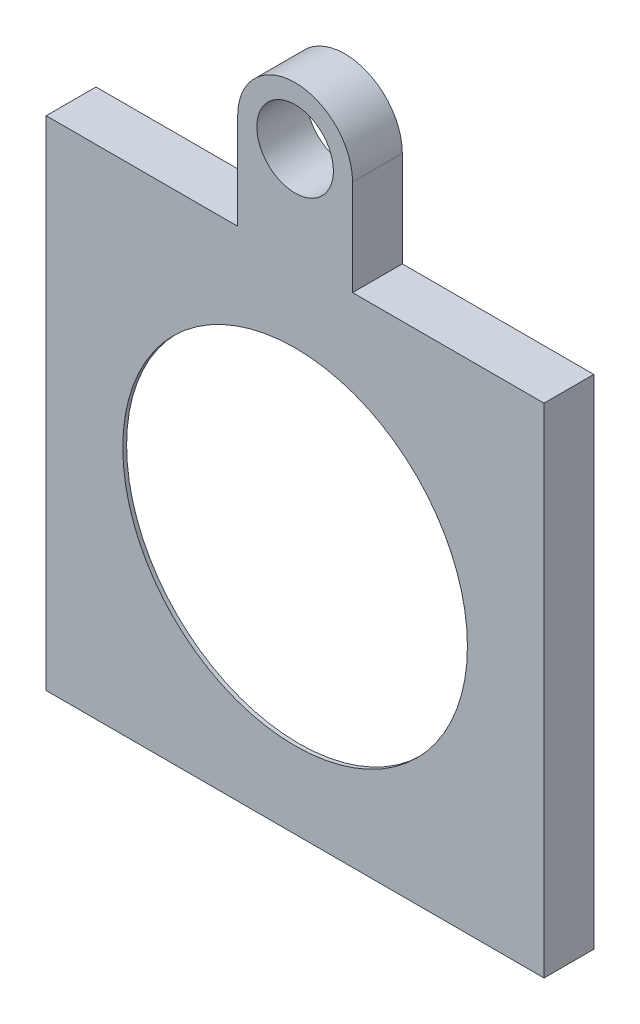
ISO-10303-21;
HEADER;
FILE_DESCRIPTION(('STEP AP214'),'2;1');
FILE_NAME('part.step','',(''),(''),'','','');
FILE_SCHEMA(('AUTOMOTIVE_DESIGN { 1 0 10303 214 1 1 1 1 }'));
ENDSEC;
DATA;
#1=APPLICATION_CONTEXT('core data for automotive mechanical design processes');
#2=APPLICATION_PROTOCOL_DEFINITION('international standard','automotive_design',2000,#1);
#3=PRODUCT_CONTEXT('',#1,'mechanical');
#4=PRODUCT('Part','Part','',(#3));
#5=PRODUCT_RELATED_PRODUCT_CATEGORY('part','',(#4));
#6=PRODUCT_DEFINITION_FORMATION('','',#4);
#7=PRODUCT_DEFINITION_CONTEXT('part definition',#1,'design');
#8=PRODUCT_DEFINITION('design','',#6,#7);
#9=PRODUCT_DEFINITION_SHAPE('','',#8);
#10=(LENGTH_UNIT() NAMED_UNIT(*) SI_UNIT(.MILLI.,.METRE.));
#11=(NAMED_UNIT(*) PLANE_ANGLE_UNIT() SI_UNIT($,.RADIAN.));
#12=(NAMED_UNIT(*) SI_UNIT($,.STERADIAN.) SOLID_ANGLE_UNIT());
#13=UNCERTAINTY_MEASURE_WITH_UNIT(LENGTH_MEASURE(1.E-05),#10,'distance_accuracy_value','');
#14=(GEOMETRIC_REPRESENTATION_CONTEXT(3) GLOBAL_UNCERTAINTY_ASSIGNED_CONTEXT((#13)) GLOBAL_UNIT_ASSIGNED_CONTEXT((#10,
#11,#12)) REPRESENTATION_CONTEXT('',''));
#15=CARTESIAN_POINT('',(0.,0.,0.));
#16=DIRECTION('',(0.,0.,1.));
#17=DIRECTION('',(1.,0.,0.));
#18=AXIS2_PLACEMENT_3D('',#15,#16,#17);
#19=CARTESIAN_POINT('',(0.,0.,0.));
#20=DIRECTION('',(0.,0.,1.));
#21=DIRECTION('',(1.,0.,0.));
#22=AXIS2_PLACEMENT_3D('',#19,#20,#21);
#23=PLANE('',#22);
#24=CARTESIAN_POINT('',(0.,9.,0.));
#25=DIRECTION('',(0.,0.,1.));
#26=DIRECTION('',(1.,0.,0.));
#27=AXIS2_PLACEMENT_3D('',#24,#25,#26);
#28=CIRCLE('',#27,1.);
#29=CARTESIAN_POINT('',(1.,9.,0.));
#30=VERTEX_POINT('',#29);
#31=EDGE_CURVE('E159',#30,#30,#28,.T.);
#32=ORIENTED_EDGE('',*,*,#31,.T.);
#33=EDGE_LOOP('',(#32));
#34=FACE_BOUND('',#33,.T.);
#35=DIRECTION('',(0.,-1.,0.));
#36=VECTOR('',#35,1.);
#37=CARTESIAN_POINT('',(-6.,6.,0.));
#38=LINE('',#37,#36);
#39=CARTESIAN_POINT('',(-6.,6.,0.));
#40=VERTEX_POINT('',#39);
#41=CARTESIAN_POINT('',(-6.,-6.,0.));
#42=VERTEX_POINT('',#41);
#43=EDGE_CURVE('E249',#40,#42,#38,.T.);
#44=ORIENTED_EDGE('',*,*,#43,.T.);
#45=DIRECTION('',(1.,0.,0.));
#46=VECTOR('',#45,1.);
#47=CARTESIAN_POINT('',(6.,-6.,0.));
#48=LINE('',#47,#46);
#49=CARTESIAN_POINT('',(6.,-6.,0.));
#50=VERTEX_POINT('',#49);
#51=EDGE_CURVE('E251',#42,#50,#48,.T.);
#52=ORIENTED_EDGE('',*,*,#51,.T.);
#53=DIRECTION('',(0.,1.,0.));
#54=VECTOR('',#53,1.);
#55=CARTESIAN_POINT('',(6.,6.,0.));
#56=LINE('',#55,#54);
#57=CARTESIAN_POINT('',(6.,6.,0.));
#58=VERTEX_POINT('',#57);
#59=EDGE_CURVE('E270',#50,#58,#56,.T.);
#60=ORIENTED_EDGE('',*,*,#59,.T.);
#61=DIRECTION('',(-1.,0.,0.));
#62=VECTOR('',#61,1.);
#63=CARTESIAN_POINT('',(6.,6.,0.));
#64=LINE('',#63,#62);
#65=EDGE_CURVE('E258',#58,#40,#64,.T.);
#66=ORIENTED_EDGE('',*,*,#65,.T.);
#67=EDGE_LOOP('',(#44,#52,#60,#66));
#68=FACE_BOUND('',#67,.T.);
#69=CARTESIAN_POINT('',(0.,9.,0.));
#70=DIRECTION('',(0.,0.,1.));
#71=DIRECTION('',(1.,0.,0.));
#72=AXIS2_PLACEMENT_3D('',#69,#70,#71);
#73=CIRCLE('',#72,1.5);
#74=CARTESIAN_POINT('',(1.5,9.,0.));
#75=VERTEX_POINT('',#74);
#76=CARTESIAN_POINT('',(-1.5,9.,0.));
#77=VERTEX_POINT('',#76);
#78=EDGE_CURVE('E188',#75,#77,#73,.T.);
#79=ORIENTED_EDGE('',*,*,#78,.F.);
#80=DIRECTION('',(0.,-1.,0.));
#81=VECTOR('',#80,1.);
#82=CARTESIAN_POINT('',(1.5,10.5,0.));
#83=LINE('',#82,#81);
#84=CARTESIAN_POINT('',(1.5,6.5,0.));
#85=VERTEX_POINT('',#84);
#86=EDGE_CURVE('E158',#75,#85,#83,.T.);
#87=ORIENTED_EDGE('',*,*,#86,.T.);
#88=DIRECTION('',(-1.,0.,0.));
#89=VECTOR('',#88,1.);
#90=CARTESIAN_POINT('',(6.5,6.5,0.));
#91=LINE('',#90,#89);
#92=CARTESIAN_POINT('',(6.5,6.5,0.));
#93=VERTEX_POINT('',#92);
#94=EDGE_CURVE('E212',#93,#85,#91,.T.);
#95=ORIENTED_EDGE('',*,*,#94,.F.);
#96=DIRECTION('',(0.,1.,0.));
#97=VECTOR('',#96,1.);
#98=CARTESIAN_POINT('',(6.5,6.5,0.));
#99=LINE('',#98,#97);
#100=CARTESIAN_POINT('',(6.5,-6.5,0.));
#101=VERTEX_POINT('',#100);
#102=EDGE_CURVE('E223',#101,#93,#99,.T.);
#103=ORIENTED_EDGE('',*,*,#102,.F.);
#104=DIRECTION('',(1.,0.,0.));
#105=VECTOR('',#104,1.);
#106=CARTESIAN_POINT('',(6.5,-6.5,0.));
#107=LINE('',#106,#105);
#108=CARTESIAN_POINT('',(-6.5,-6.5,0.));
#109=VERTEX_POINT('',#108);
#110=EDGE_CURVE('E221',#109,#101,#107,.T.);
#111=ORIENTED_EDGE('',*,*,#110,.F.);
#112=DIRECTION('',(0.,-1.,0.));
#113=VECTOR('',#112,1.);
#114=CARTESIAN_POINT('',(-6.5,6.5,0.));
#115=LINE('',#114,#113);
#116=CARTESIAN_POINT('',(-6.5,6.5,0.));
#117=VERTEX_POINT('',#116);
#118=EDGE_CURVE('E218',#117,#109,#115,.T.);
#119=ORIENTED_EDGE('',*,*,#118,.F.);
#120=CARTESIAN_POINT('',(-1.5,6.5,0.));
#121=VERTEX_POINT('',#120);
#122=EDGE_CURVE('E209',#121,#117,#91,.T.);
#123=ORIENTED_EDGE('',*,*,#122,.F.);
#124=DIRECTION('',(0.,-1.,0.));
#125=VECTOR('',#124,1.);
#126=CARTESIAN_POINT('',(-1.5,10.5,0.));
#127=LINE('',#126,#125);
#128=EDGE_CURVE('E168',#77,#121,#127,.T.);
#129=ORIENTED_EDGE('',*,*,#128,.F.);
#130=EDGE_LOOP('',(#79,#87,#95,#103,#111,#119,#123,#129));
#131=FACE_BOUND('',#130,.T.);
#132=ADVANCED_FACE('F57',(#34,#68,#131),#23,.F.);
#133=CARTESIAN_POINT('',(0.,0.,1.3));
#134=DIRECTION('',(0.,0.,-1.));
#135=DIRECTION('',(-1.,0.,0.));
#136=AXIS2_PLACEMENT_3D('',#133,#134,#135);
#137=PLANE('',#136);
#138=CARTESIAN_POINT('',(0.,9.,1.3));
#139=DIRECTION('',(0.,0.,1.));
#140=DIRECTION('',(1.,0.,0.));
#141=AXIS2_PLACEMENT_3D('',#138,#139,#140);
#142=CIRCLE('',#141,1.);
#143=CARTESIAN_POINT('',(1.,9.,1.3));
#144=VERTEX_POINT('',#143);
#145=EDGE_CURVE('E333',#144,#144,#142,.T.);
#146=ORIENTED_EDGE('',*,*,#145,.F.);
#147=EDGE_LOOP('',(#146));
#148=FACE_BOUND('',#147,.T.);
#149=CARTESIAN_POINT('',(0.,0.,1.3));
#150=DIRECTION('',(0.,0.,1.));
#151=DIRECTION('',(1.,0.,0.));
#152=AXIS2_PLACEMENT_3D('',#149,#150,#151);
#153=CIRCLE('',#152,4.5);
#154=CARTESIAN_POINT('',(4.5,0.,1.3));
#155=VERTEX_POINT('',#154);
#156=EDGE_CURVE('E194',#155,#155,#153,.T.);
#157=ORIENTED_EDGE('',*,*,#156,.F.);
#158=EDGE_LOOP('',(#157));
#159=FACE_BOUND('',#158,.T.);
#160=DIRECTION('',(0.,-1.,0.));
#161=VECTOR('',#160,1.);
#162=CARTESIAN_POINT('',(1.5,10.5,1.3));
#163=LINE('',#162,#161);
#164=CARTESIAN_POINT('',(1.5,9.,1.3));
#165=VERTEX_POINT('',#164);
#166=CARTESIAN_POINT('',(1.49999999999999,6.5,1.3));
#167=VERTEX_POINT('',#166);
#168=EDGE_CURVE('E61',#165,#167,#163,.T.);
#169=ORIENTED_EDGE('',*,*,#168,.F.);
#170=CARTESIAN_POINT('',(0.,9.,1.3));
#171=DIRECTION('',(0.,0.,1.));
#172=DIRECTION('',(1.,0.,0.));
#173=AXIS2_PLACEMENT_3D('',#170,#171,#172);
#174=CIRCLE('',#173,1.5);
#175=CARTESIAN_POINT('',(-1.5,9.,1.3));
#176=VERTEX_POINT('',#175);
#177=EDGE_CURVE('E150',#165,#176,#174,.T.);
#178=ORIENTED_EDGE('',*,*,#177,.T.);
#179=DIRECTION('',(0.,-1.,0.));
#180=VECTOR('',#179,1.);
#181=CARTESIAN_POINT('',(-1.5,10.5,1.3));
#182=LINE('',#181,#180);
#183=CARTESIAN_POINT('',(-1.50000000000001,6.5,1.3));
#184=VERTEX_POINT('',#183);
#185=EDGE_CURVE('E75',#176,#184,#182,.T.);
#186=ORIENTED_EDGE('',*,*,#185,.T.);
#187=DIRECTION('',(-1.,0.,0.));
#188=VECTOR('',#187,1.);
#189=CARTESIAN_POINT('',(-6.5,6.5,1.3));
#190=LINE('',#189,#188);
#191=CARTESIAN_POINT('',(-6.5,6.5,1.3));
#192=VERTEX_POINT('',#191);
#193=EDGE_CURVE('E201',#184,#192,#190,.T.);
#194=ORIENTED_EDGE('',*,*,#193,.T.);
#195=DIRECTION('',(0.,-1.,0.));
#196=VECTOR('',#195,1.);
#197=CARTESIAN_POINT('',(-6.5,-6.5,1.3));
#198=LINE('',#197,#196);
#199=CARTESIAN_POINT('',(-6.5,-6.5,1.3));
#200=VERTEX_POINT('',#199);
#201=EDGE_CURVE('E204',#192,#200,#198,.T.);
#202=ORIENTED_EDGE('',*,*,#201,.T.);
#203=DIRECTION('',(1.,0.,0.));
#204=VECTOR('',#203,1.);
#205=CARTESIAN_POINT('',(-6.5,-6.5,1.3));
#206=LINE('',#205,#204);
#207=CARTESIAN_POINT('',(6.5,-6.5,1.3));
#208=VERTEX_POINT('',#207);
#209=EDGE_CURVE('E237',#200,#208,#206,.T.);
#210=ORIENTED_EDGE('',*,*,#209,.T.);
#211=DIRECTION('',(0.,1.,0.));
#212=VECTOR('',#211,1.);
#213=CARTESIAN_POINT('',(6.5,-6.5,1.3));
#214=LINE('',#213,#212);
#215=CARTESIAN_POINT('',(6.5,6.5,1.3));
#216=VERTEX_POINT('',#215);
#217=EDGE_CURVE('E197',#208,#216,#214,.T.);
#218=ORIENTED_EDGE('',*,*,#217,.T.);
#219=EDGE_CURVE('E165',#216,#167,#190,.T.);
#220=ORIENTED_EDGE('',*,*,#219,.T.);
#221=EDGE_LOOP('',(#169,#178,#186,#194,#202,#210,#218,#220));
#222=FACE_BOUND('',#221,.T.);
#223=ADVANCED_FACE('F162',(#148,#159,#222),#137,.F.);
#224=CARTESIAN_POINT('',(-1.5,10.5,0.));
#225=DIRECTION('',(1.,0.,0.));
#226=DIRECTION('',(0.,0.,-1.));
#227=AXIS2_PLACEMENT_3D('',#224,#225,#226);
#228=PLANE('',#227);
#229=DIRECTION('',(0.,0.,1.));
#230=VECTOR('',#229,1.);
#231=CARTESIAN_POINT('',(-1.5,9.,-2.7));
#232=LINE('',#231,#230);
#233=EDGE_CURVE('E155',#77,#176,#232,.T.);
#234=ORIENTED_EDGE('',*,*,#233,.F.);
#235=ORIENTED_EDGE('',*,*,#128,.T.);
#236=DIRECTION('',(0.,0.,1.));
#237=VECTOR('',#236,1.);
#238=CARTESIAN_POINT('',(-1.5,6.5,0.));
#239=LINE('',#238,#237);
#240=EDGE_CURVE('E184',#121,#184,#239,.T.);
#241=ORIENTED_EDGE('',*,*,#240,.T.);
#242=ORIENTED_EDGE('',*,*,#185,.F.);
#243=EDGE_LOOP('',(#234,#235,#241,#242));
#244=FACE_BOUND('',#243,.T.);
#245=ADVANCED_FACE('F312',(#244),#228,.F.);
#246=CARTESIAN_POINT('',(6.5,6.5,1.2));
#247=DIRECTION('',(0.,-1.,0.));
#248=DIRECTION('',(1.,0.,0.));
#249=AXIS2_PLACEMENT_3D('',#246,#247,#248);
#250=PLANE('',#249);
#251=ORIENTED_EDGE('',*,*,#240,.F.);
#252=ORIENTED_EDGE('',*,*,#122,.T.);
#253=DIRECTION('',(0.,0.,-1.));
#254=VECTOR('',#253,1.);
#255=CARTESIAN_POINT('',(-6.5,6.5,1.2));
#256=LINE('',#255,#254);
#257=EDGE_CURVE('E12',#192,#117,#256,.T.);
#258=ORIENTED_EDGE('',*,*,#257,.F.);
#259=ORIENTED_EDGE('',*,*,#193,.F.);
#260=EDGE_LOOP('',(#251,#252,#258,#259));
#261=FACE_BOUND('',#260,.T.);
#262=ADVANCED_FACE('F59',(#261),#250,.F.);
#263=DIRECTION('',(0.,0.,-1.));
#264=VECTOR('',#263,1.);
#265=CARTESIAN_POINT('',(1.5,6.5,0.));
#266=LINE('',#265,#264);
#267=EDGE_CURVE('E172',#167,#85,#266,.T.);
#268=ORIENTED_EDGE('',*,*,#267,.F.);
#269=ORIENTED_EDGE('',*,*,#219,.F.);
#270=DIRECTION('',(0.,0.,-1.));
#271=VECTOR('',#270,1.);
#272=CARTESIAN_POINT('',(6.5,6.5,1.2));
#273=LINE('',#272,#271);
#274=EDGE_CURVE('E225',#216,#93,#273,.T.);
#275=ORIENTED_EDGE('',*,*,#274,.T.);
#276=ORIENTED_EDGE('',*,*,#94,.T.);
#277=EDGE_LOOP('',(#268,#269,#275,#276));
#278=FACE_BOUND('',#277,.T.);
#279=ADVANCED_FACE('F248',(#278),#250,.F.);
#280=CARTESIAN_POINT('',(-6.5,6.5,1.2));
#281=DIRECTION('',(1.,0.,0.));
#282=DIRECTION('',(0.,1.,0.));
#283=AXIS2_PLACEMENT_3D('',#280,#281,#282);
#284=PLANE('',#283);
#285=ORIENTED_EDGE('',*,*,#118,.T.);
#286=DIRECTION('',(0.,0.,-1.));
#287=VECTOR('',#286,1.);
#288=CARTESIAN_POINT('',(-6.5,-6.5,1.2));
#289=LINE('',#288,#287);
#290=EDGE_CURVE('E67',#200,#109,#289,.T.);
#291=ORIENTED_EDGE('',*,*,#290,.F.);
#292=ORIENTED_EDGE('',*,*,#201,.F.);
#293=ORIENTED_EDGE('',*,*,#257,.T.);
#294=EDGE_LOOP('',(#285,#291,#292,#293));
#295=FACE_BOUND('',#294,.T.);
#296=ADVANCED_FACE('F321',(#295),#284,.F.);
#297=CARTESIAN_POINT('',(6.5,-6.5,1.2));
#298=DIRECTION('',(0.,1.,0.));
#299=DIRECTION('',(-1.,0.,0.));
#300=AXIS2_PLACEMENT_3D('',#297,#298,#299);
#301=PLANE('',#300);
#302=ORIENTED_EDGE('',*,*,#110,.T.);
#303=DIRECTION('',(0.,0.,-1.));
#304=VECTOR('',#303,1.);
#305=CARTESIAN_POINT('',(6.5,-6.5,1.2));
#306=LINE('',#305,#304);
#307=EDGE_CURVE('E228',#208,#101,#306,.T.);
#308=ORIENTED_EDGE('',*,*,#307,.F.);
#309=ORIENTED_EDGE('',*,*,#209,.F.);
#310=ORIENTED_EDGE('',*,*,#290,.T.);
#311=EDGE_LOOP('',(#302,#308,#309,#310));
#312=FACE_BOUND('',#311,.T.);
#313=ADVANCED_FACE('F235',(#312),#301,.F.);
#314=CARTESIAN_POINT('',(6.5,6.5,1.2));
#315=DIRECTION('',(-1.,0.,0.));
#316=DIRECTION('',(0.,-1.,0.));
#317=AXIS2_PLACEMENT_3D('',#314,#315,#316);
#318=PLANE('',#317);
#319=ORIENTED_EDGE('',*,*,#102,.T.);
#320=ORIENTED_EDGE('',*,*,#274,.F.);
#321=ORIENTED_EDGE('',*,*,#217,.F.);
#322=ORIENTED_EDGE('',*,*,#307,.T.);
#323=EDGE_LOOP('',(#319,#320,#321,#322));
#324=FACE_BOUND('',#323,.T.);
#325=ADVANCED_FACE('F245',(#324),#318,.F.);
#326=CARTESIAN_POINT('',(-6.,6.,1.2));
#327=DIRECTION('',(1.,0.,0.));
#328=DIRECTION('',(0.,1.,0.));
#329=AXIS2_PLACEMENT_3D('',#326,#327,#328);
#330=PLANE('',#329);
#331=ORIENTED_EDGE('',*,*,#43,.F.);
#332=DIRECTION('',(0.,0.,-1.));
#333=VECTOR('',#332,1.);
#334=CARTESIAN_POINT('',(-6.,6.,1.2));
#335=LINE('',#334,#333);
#336=CARTESIAN_POINT('',(-6.,6.,1.2));
#337=VERTEX_POINT('',#336);
#338=EDGE_CURVE('E266',#337,#40,#335,.T.);
#339=ORIENTED_EDGE('',*,*,#338,.F.);
#340=DIRECTION('',(0.,-1.,0.));
#341=VECTOR('',#340,1.);
#342=CARTESIAN_POINT('',(-6.,6.,1.2));
#343=LINE('',#342,#341);
#344=CARTESIAN_POINT('',(-6.,-6.,1.2));
#345=VERTEX_POINT('',#344);
#346=EDGE_CURVE('E254',#337,#345,#343,.T.);
#347=ORIENTED_EDGE('',*,*,#346,.T.);
#348=DIRECTION('',(0.,0.,-1.));
#349=VECTOR('',#348,1.);
#350=CARTESIAN_POINT('',(-6.,-6.,1.2));
#351=LINE('',#350,#349);
#352=EDGE_CURVE('E213',#345,#42,#351,.T.);
#353=ORIENTED_EDGE('',*,*,#352,.T.);
#354=EDGE_LOOP('',(#331,#339,#347,#353));
#355=FACE_BOUND('',#354,.T.);
#356=ADVANCED_FACE('F285',(#355),#330,.T.);
#357=CARTESIAN_POINT('',(6.,-6.,1.2));
#358=DIRECTION('',(0.,1.,0.));
#359=DIRECTION('',(-1.,0.,0.));
#360=AXIS2_PLACEMENT_3D('',#357,#358,#359);
#361=PLANE('',#360);
#362=ORIENTED_EDGE('',*,*,#51,.F.);
#363=ORIENTED_EDGE('',*,*,#352,.F.);
#364=DIRECTION('',(1.,0.,0.));
#365=VECTOR('',#364,1.);
#366=CARTESIAN_POINT('',(6.,-6.,1.2));
#367=LINE('',#366,#365);
#368=CARTESIAN_POINT('',(6.,-6.,1.2));
#369=VERTEX_POINT('',#368);
#370=EDGE_CURVE('E257',#345,#369,#367,.T.);
#371=ORIENTED_EDGE('',*,*,#370,.T.);
#372=DIRECTION('',(0.,0.,-1.));
#373=VECTOR('',#372,1.);
#374=CARTESIAN_POINT('',(6.,-6.,1.2));
#375=LINE('',#374,#373);
#376=EDGE_CURVE('E278',#369,#50,#375,.T.);
#377=ORIENTED_EDGE('',*,*,#376,.T.);
#378=EDGE_LOOP('',(#362,#363,#371,#377));
#379=FACE_BOUND('',#378,.T.);
#380=ADVANCED_FACE('F295',(#379),#361,.T.);
#381=CARTESIAN_POINT('',(6.,6.,1.2));
#382=DIRECTION('',(-1.,0.,0.));
#383=DIRECTION('',(0.,-1.,0.));
#384=AXIS2_PLACEMENT_3D('',#381,#382,#383);
#385=PLANE('',#384);
#386=ORIENTED_EDGE('',*,*,#59,.F.);
#387=ORIENTED_EDGE('',*,*,#376,.F.);
#388=DIRECTION('',(0.,1.,0.));
#389=VECTOR('',#388,1.);
#390=CARTESIAN_POINT('',(6.,6.,1.2));
#391=LINE('',#390,#389);
#392=CARTESIAN_POINT('',(6.,6.,1.2));
#393=VERTEX_POINT('',#392);
#394=EDGE_CURVE('E261',#369,#393,#391,.T.);
#395=ORIENTED_EDGE('',*,*,#394,.T.);
#396=DIRECTION('',(0.,0.,-1.));
#397=VECTOR('',#396,1.);
#398=CARTESIAN_POINT('',(6.,6.,1.2));
#399=LINE('',#398,#397);
#400=EDGE_CURVE('E277',#393,#58,#399,.T.);
#401=ORIENTED_EDGE('',*,*,#400,.T.);
#402=EDGE_LOOP('',(#386,#387,#395,#401));
#403=FACE_BOUND('',#402,.T.);
#404=ADVANCED_FACE('F297',(#403),#385,.T.);
#405=CARTESIAN_POINT('',(6.,6.,1.2));
#406=DIRECTION('',(0.,-1.,0.));
#407=DIRECTION('',(1.,0.,0.));
#408=AXIS2_PLACEMENT_3D('',#405,#406,#407);
#409=PLANE('',#408);
#410=ORIENTED_EDGE('',*,*,#65,.F.);
#411=ORIENTED_EDGE('',*,*,#400,.F.);
#412=DIRECTION('',(-1.,0.,0.));
#413=VECTOR('',#412,1.);
#414=CARTESIAN_POINT('',(6.,6.,1.2));
#415=LINE('',#414,#413);
#416=EDGE_CURVE('E264',#393,#337,#415,.T.);
#417=ORIENTED_EDGE('',*,*,#416,.T.);
#418=ORIENTED_EDGE('',*,*,#338,.T.);
#419=EDGE_LOOP('',(#410,#411,#417,#418));
#420=FACE_BOUND('',#419,.T.);
#421=ADVANCED_FACE('F291',(#420),#409,.T.);
#422=CARTESIAN_POINT('',(0.,0.,1.2));
#423=DIRECTION('',(0.,0.,-1.));
#424=DIRECTION('',(-1.,0.,0.));
#425=AXIS2_PLACEMENT_3D('',#422,#423,#424);
#426=PLANE('',#425);
#427=ORIENTED_EDGE('',*,*,#370,.F.);
#428=ORIENTED_EDGE('',*,*,#346,.F.);
#429=ORIENTED_EDGE('',*,*,#416,.F.);
#430=ORIENTED_EDGE('',*,*,#394,.F.);
#431=EDGE_LOOP('',(#427,#428,#429,#430));
#432=FACE_BOUND('',#431,.T.);
#433=CARTESIAN_POINT('',(0.,0.,1.2));
#434=DIRECTION('',(0.,0.,1.));
#435=DIRECTION('',(1.,0.,0.));
#436=AXIS2_PLACEMENT_3D('',#433,#434,#435);
#437=CIRCLE('',#436,4.5);
#438=CARTESIAN_POINT('',(4.5,0.,1.2));
#439=VERTEX_POINT('',#438);
#440=EDGE_CURVE('E166',#439,#439,#437,.T.);
#441=ORIENTED_EDGE('',*,*,#440,.T.);
#442=EDGE_LOOP('',(#441));
#443=FACE_BOUND('',#442,.T.);
#444=ADVANCED_FACE('F293',(#432,#443),#426,.T.);
#445=CARTESIAN_POINT('',(0.,0.,1.3));
#446=DIRECTION('',(0.,0.,-1.));
#447=DIRECTION('',(-1.,0.,0.));
#448=AXIS2_PLACEMENT_3D('',#445,#446,#447);
#449=CYLINDRICAL_SURFACE('',#448,4.5);
#450=ORIENTED_EDGE('',*,*,#156,.T.);
#451=EDGE_LOOP('',(#450));
#452=FACE_BOUND('',#451,.T.);
#453=ORIENTED_EDGE('',*,*,#440,.F.);
#454=EDGE_LOOP('',(#453));
#455=FACE_BOUND('',#454,.T.);
#456=ADVANCED_FACE('F342',(#452,#455),#449,.F.);
#457=CARTESIAN_POINT('',(1.5,10.5,0.));
#458=DIRECTION('',(-1.,0.,0.));
#459=DIRECTION('',(0.,0.,1.));
#460=AXIS2_PLACEMENT_3D('',#457,#458,#459);
#461=PLANE('',#460);
#462=ORIENTED_EDGE('',*,*,#86,.F.);
#463=DIRECTION('',(0.,0.,1.));
#464=VECTOR('',#463,1.);
#465=CARTESIAN_POINT('',(1.5,9.,-2.7));
#466=LINE('',#465,#464);
#467=EDGE_CURVE('E152',#75,#165,#466,.T.);
#468=ORIENTED_EDGE('',*,*,#467,.T.);
#469=ORIENTED_EDGE('',*,*,#168,.T.);
#470=ORIENTED_EDGE('',*,*,#267,.T.);
#471=EDGE_LOOP('',(#462,#468,#469,#470));
#472=FACE_BOUND('',#471,.T.);
#473=ADVANCED_FACE('F157',(#472),#461,.F.);
#474=CARTESIAN_POINT('',(0.,9.,-2.7));
#475=DIRECTION('',(0.,0.,1.));
#476=DIRECTION('',(1.,0.,0.));
#477=AXIS2_PLACEMENT_3D('',#474,#475,#476);
#478=CYLINDRICAL_SURFACE('',#477,1.5);
#479=ORIENTED_EDGE('',*,*,#78,.T.);
#480=ORIENTED_EDGE('',*,*,#233,.T.);
#481=ORIENTED_EDGE('',*,*,#177,.F.);
#482=ORIENTED_EDGE('',*,*,#467,.F.);
#483=EDGE_LOOP('',(#479,#480,#481,#482));
#484=FACE_BOUND('',#483,.T.);
#485=ADVANCED_FACE('F151',(#484),#478,.T.);
#486=CARTESIAN_POINT('',(0.,9.,-2.7));
#487=DIRECTION('',(0.,0.,1.));
#488=DIRECTION('',(1.,0.,0.));
#489=AXIS2_PLACEMENT_3D('',#486,#487,#488);
#490=CYLINDRICAL_SURFACE('',#489,1.);
#491=ORIENTED_EDGE('',*,*,#145,.T.);
#492=EDGE_LOOP('',(#491));
#493=FACE_BOUND('',#492,.T.);
#494=ORIENTED_EDGE('',*,*,#31,.F.);
#495=EDGE_LOOP('',(#494));
#496=FACE_BOUND('',#495,.T.);
#497=ADVANCED_FACE('F337',(#493,#496),#490,.F.);
#498=CLOSED_SHELL('',(#132,#223,#245,#262,#279,#296,#313,#325,#356,#380,#404,#421,#444,#456,
#473,#485,#497));
#499=MANIFOLD_SOLID_BREP('B2',#498);
#500=ADVANCED_BREP_SHAPE_REPRESENTATION('',(#18,#499),#14);
#501=SHAPE_DEFINITION_REPRESENTATION(#9,#500);
ENDSEC;
END-ISO-10303-21;
